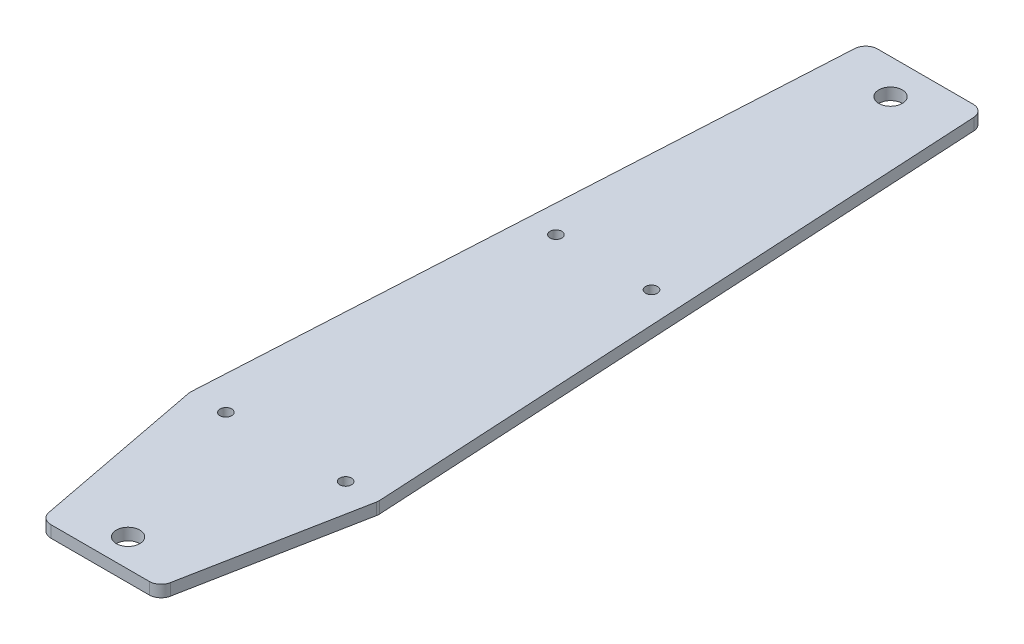
ISO-10303-21;
HEADER;
FILE_DESCRIPTION(('STEP AP214'),'2;1');
FILE_NAME('part.step','',(''),(''),'','','');
FILE_SCHEMA(('AUTOMOTIVE_DESIGN { 1 0 10303 214 1 1 1 1 }'));
ENDSEC;
DATA;
#1=APPLICATION_CONTEXT('core data for automotive mechanical design processes');
#2=APPLICATION_PROTOCOL_DEFINITION('international standard','automotive_design',2000,#1);
#3=PRODUCT_CONTEXT('',#1,'mechanical');
#4=PRODUCT('Part','Part','',(#3));
#5=PRODUCT_RELATED_PRODUCT_CATEGORY('part','',(#4));
#6=PRODUCT_DEFINITION_FORMATION('','',#4);
#7=PRODUCT_DEFINITION_CONTEXT('part definition',#1,'design');
#8=PRODUCT_DEFINITION('design','',#6,#7);
#9=PRODUCT_DEFINITION_SHAPE('','',#8);
#10=(LENGTH_UNIT() NAMED_UNIT(*) SI_UNIT(.MILLI.,.METRE.));
#11=(NAMED_UNIT(*) PLANE_ANGLE_UNIT() SI_UNIT($,.RADIAN.));
#12=(NAMED_UNIT(*) SI_UNIT($,.STERADIAN.) SOLID_ANGLE_UNIT());
#13=UNCERTAINTY_MEASURE_WITH_UNIT(LENGTH_MEASURE(1.E-05),#10,'distance_accuracy_value','');
#14=(GEOMETRIC_REPRESENTATION_CONTEXT(3) GLOBAL_UNCERTAINTY_ASSIGNED_CONTEXT((#13)) GLOBAL_UNIT_ASSIGNED_CONTEXT((#10,
#11,#12)) REPRESENTATION_CONTEXT('',''));
#15=CARTESIAN_POINT('',(0.,0.,0.));
#16=DIRECTION('',(0.,0.,1.));
#17=DIRECTION('',(1.,0.,0.));
#18=AXIS2_PLACEMENT_3D('',#15,#16,#17);
#19=CARTESIAN_POINT('',(0.,5.,0.));
#20=DIRECTION('',(0.,0.,-1.));
#21=DIRECTION('',(-1.,0.,0.));
#22=AXIS2_PLACEMENT_3D('',#19,#20,#21);
#23=PLANE('',#22);
#24=DIRECTION('',(1.,0.,0.));
#25=VECTOR('',#24,1.);
#26=CARTESIAN_POINT('',(0.,0.,0.));
#27=LINE('',#26,#25);
#28=CARTESIAN_POINT('',(4.13012721746611,0.,0.));
#29=VERTEX_POINT('',#28);
#30=CARTESIAN_POINT('',(45.8698727825338,0.,0.));
#31=VERTEX_POINT('',#30);
#32=EDGE_CURVE('E193',#29,#31,#27,.T.);
#33=ORIENTED_EDGE('',*,*,#32,.T.);
#34=DIRECTION('',(0.,-1.,0.));
#35=VECTOR('',#34,1.);
#36=CARTESIAN_POINT('',(45.8698727825338,5.,0.));
#37=LINE('',#36,#35);
#38=CARTESIAN_POINT('',(45.8698727825338,5.,0.));
#39=VERTEX_POINT('',#38);
#40=EDGE_CURVE('E11',#39,#31,#37,.T.);
#41=ORIENTED_EDGE('',*,*,#40,.F.);
#42=DIRECTION('',(1.,0.,0.));
#43=VECTOR('',#42,1.);
#44=CARTESIAN_POINT('',(0.,5.,0.));
#45=LINE('',#44,#43);
#46=CARTESIAN_POINT('',(4.13012721746611,5.,0.));
#47=VERTEX_POINT('',#46);
#48=EDGE_CURVE('E510',#47,#39,#45,.T.);
#49=ORIENTED_EDGE('',*,*,#48,.F.);
#50=DIRECTION('',(0.,-1.,0.));
#51=VECTOR('',#50,1.);
#52=CARTESIAN_POINT('',(4.13012721746611,5.,0.));
#53=LINE('',#52,#51);
#54=EDGE_CURVE('E59',#47,#29,#53,.T.);
#55=ORIENTED_EDGE('',*,*,#54,.T.);
#56=EDGE_LOOP('',(#33,#41,#49,#55));
#57=FACE_BOUND('',#56,.T.);
#58=ADVANCED_FACE('F41',(#57),#23,.F.);
#59=CARTESIAN_POINT('',(45.8698727825339,5.,-5.));
#60=DIRECTION('',(0.,-1.,0.));
#61=DIRECTION('',(0.,0.,-1.));
#62=AXIS2_PLACEMENT_3D('',#59,#60,#61);
#63=CYLINDRICAL_SURFACE('',#62,4.99999999999992);
#64=CARTESIAN_POINT('',(45.8698727825339,0.,-5.));
#65=DIRECTION('',(0.,1.,0.));
#66=DIRECTION('',(0.,0.,1.));
#67=AXIS2_PLACEMENT_3D('',#64,#65,#66);
#68=CIRCLE('',#67,4.99999999999992);
#69=CARTESIAN_POINT('',(50.7799161105115,0.,-4.05582071756382));
#70=VERTEX_POINT('',#69);
#71=EDGE_CURVE('E196',#31,#70,#68,.T.);
#72=ORIENTED_EDGE('',*,*,#71,.T.);
#73=DIRECTION('',(0.,-1.,0.));
#74=VECTOR('',#73,1.);
#75=CARTESIAN_POINT('',(50.7799161105115,5.,-4.05582071756382));
#76=LINE('',#75,#74);
#77=CARTESIAN_POINT('',(50.7799161105115,5.,-4.05582071756382));
#78=VERTEX_POINT('',#77);
#79=EDGE_CURVE('E51',#78,#70,#76,.T.);
#80=ORIENTED_EDGE('',*,*,#79,.F.);
#81=CARTESIAN_POINT('',(45.8698727825339,5.,-5.));
#82=DIRECTION('',(0.,1.,0.));
#83=DIRECTION('',(0.,0.,1.));
#84=AXIS2_PLACEMENT_3D('',#81,#82,#83);
#85=CIRCLE('',#84,4.99999999999992);
#86=EDGE_CURVE('E109',#39,#78,#85,.T.);
#87=ORIENTED_EDGE('',*,*,#86,.F.);
#88=ORIENTED_EDGE('',*,*,#40,.T.);
#89=EDGE_LOOP('',(#72,#80,#87,#88));
#90=FACE_BOUND('',#89,.T.);
#91=ADVANCED_FACE('F320',(#90),#63,.T.);
#92=CARTESIAN_POINT('',(48.2170509652366,5.,9.27192237228111));
#93=DIRECTION('',(-0.982008665595539,0.,-0.188835856487237));
#94=DIRECTION('',(-0.188835856487237,0.,0.982008665595539));
#95=AXIS2_PLACEMENT_3D('',#92,#93,#94);
#96=PLANE('',#95);
#97=DIRECTION('',(0.188835856487237,0.,-0.982008665595539));
#98=VECTOR('',#97,1.);
#99=CARTESIAN_POINT('',(48.2170509652366,0.,9.27192237228111));
#100=LINE('',#99,#98);
#101=CARTESIAN_POINT('',(64.8837230235631,0.,-77.4002631563285));
#102=VERTEX_POINT('',#101);
#103=EDGE_CURVE('E199',#70,#102,#100,.T.);
#104=ORIENTED_EDGE('',*,*,#103,.T.);
#105=DIRECTION('',(0.,-1.,0.));
#106=VECTOR('',#105,1.);
#107=CARTESIAN_POINT('',(64.8837230235631,5.,-77.4002631563285));
#108=LINE('',#107,#106);
#109=CARTESIAN_POINT('',(64.8837230235631,5.,-77.4002631563285));
#110=VERTEX_POINT('',#109);
#111=EDGE_CURVE('E256',#110,#102,#108,.T.);
#112=ORIENTED_EDGE('',*,*,#111,.F.);
#113=DIRECTION('',(0.188835856487237,0.,-0.982008665595539));
#114=VECTOR('',#113,1.);
#115=CARTESIAN_POINT('',(48.2170509652366,5.,9.27192237228111));
#116=LINE('',#115,#114);
#117=EDGE_CURVE('E266',#78,#110,#116,.T.);
#118=ORIENTED_EDGE('',*,*,#117,.F.);
#119=ORIENTED_EDGE('',*,*,#79,.T.);
#120=EDGE_LOOP('',(#104,#112,#118,#119));
#121=FACE_BOUND('',#120,.T.);
#122=ADVANCED_FACE('F264',(#121),#96,.F.);
#123=CARTESIAN_POINT('',(59.9736796955854,5.,-78.3444424387646));
#124=DIRECTION('',(0.,-1.,0.));
#125=DIRECTION('',(0.,0.,-1.));
#126=AXIS2_PLACEMENT_3D('',#123,#124,#125);
#127=CYLINDRICAL_SURFACE('',#126,5.);
#128=CARTESIAN_POINT('',(59.9736796955854,0.,-78.3444424387646));
#129=DIRECTION('',(0.,1.,0.));
#130=DIRECTION('',(0.,0.,1.));
#131=AXIS2_PLACEMENT_3D('',#128,#129,#130);
#132=CIRCLE('',#131,5.);
#133=CARTESIAN_POINT('',(64.9660937231544,0.,-78.6197643909094));
#134=VERTEX_POINT('',#133);
#135=EDGE_CURVE('E202',#102,#134,#132,.T.);
#136=ORIENTED_EDGE('',*,*,#135,.T.);
#137=DIRECTION('',(0.,-1.,0.));
#138=VECTOR('',#137,1.);
#139=CARTESIAN_POINT('',(64.9660937231544,5.,-78.6197643909094));
#140=LINE('',#139,#138);
#141=CARTESIAN_POINT('',(64.9660937231544,5.,-78.6197643909094));
#142=VERTEX_POINT('',#141);
#143=EDGE_CURVE('E253',#142,#134,#140,.T.);
#144=ORIENTED_EDGE('',*,*,#143,.F.);
#145=CARTESIAN_POINT('',(59.9736796955854,5.,-78.3444424387646));
#146=DIRECTION('',(0.,1.,0.));
#147=DIRECTION('',(0.,0.,1.));
#148=AXIS2_PLACEMENT_3D('',#145,#146,#147);
#149=CIRCLE('',#148,5.);
#150=EDGE_CURVE('E276',#110,#142,#149,.T.);
#151=ORIENTED_EDGE('',*,*,#150,.F.);
#152=ORIENTED_EDGE('',*,*,#111,.T.);
#153=EDGE_LOOP('',(#136,#144,#151,#152));
#154=FACE_BOUND('',#153,.T.);
#155=ADVANCED_FACE('F273',(#154),#127,.T.);
#156=CARTESIAN_POINT('',(69.0916921091236,5.,-3.81027283462876));
#157=DIRECTION('',(0.99848280551379,0.,-0.055064390428943));
#158=DIRECTION('',(-0.055064390428943,0.,-0.99848280551379));
#159=AXIS2_PLACEMENT_3D('',#156,#157,#158);
#160=PLANE('',#159);
#161=DIRECTION('',(0.055064390428943,0.,0.99848280551379));
#162=VECTOR('',#161,1.);
#163=CARTESIAN_POINT('',(69.0916921091236,0.,-3.81027283462876));
#164=LINE('',#163,#162);
#165=CARTESIAN_POINT('',(50.2605568320671,0.,-345.275321952145));
#166=VERTEX_POINT('',#165);
#167=EDGE_CURVE('E206',#166,#134,#164,.T.);
#168=ORIENTED_EDGE('',*,*,#167,.F.);
#169=DIRECTION('',(0.,-1.,0.));
#170=VECTOR('',#169,1.);
#171=CARTESIAN_POINT('',(50.2605568320671,5.,-345.275321952145));
#172=LINE('',#171,#170);
#173=CARTESIAN_POINT('',(50.2605568320671,5.,-345.275321952145));
#174=VERTEX_POINT('',#173);
#175=EDGE_CURVE('E250',#174,#166,#172,.T.);
#176=ORIENTED_EDGE('',*,*,#175,.F.);
#177=DIRECTION('',(0.055064390428943,0.,0.99848280551379));
#178=VECTOR('',#177,1.);
#179=CARTESIAN_POINT('',(69.0916921091236,5.,-3.81027283462876));
#180=LINE('',#179,#178);
#181=EDGE_CURVE('E279',#174,#142,#180,.T.);
#182=ORIENTED_EDGE('',*,*,#181,.T.);
#183=ORIENTED_EDGE('',*,*,#143,.T.);
#184=EDGE_LOOP('',(#168,#176,#182,#183));
#185=FACE_BOUND('',#184,.T.);
#186=ADVANCED_FACE('F470',(#185),#160,.T.);
#187=CARTESIAN_POINT('',(45.2681428044982,5.,-345.));
#188=DIRECTION('',(0.,-1.,0.));
#189=DIRECTION('',(0.,0.,-1.));
#190=AXIS2_PLACEMENT_3D('',#187,#188,#189);
#191=CYLINDRICAL_SURFACE('',#190,5.);
#192=CARTESIAN_POINT('',(45.2681428044982,0.,-345.));
#193=DIRECTION('',(0.,1.,0.));
#194=DIRECTION('',(0.,0.,1.));
#195=AXIS2_PLACEMENT_3D('',#192,#193,#194);
#196=CIRCLE('',#195,5.);
#197=CARTESIAN_POINT('',(45.2681428044981,0.,-350.));
#198=VERTEX_POINT('',#197);
#199=EDGE_CURVE('E210',#198,#166,#196,.F.);
#200=ORIENTED_EDGE('',*,*,#199,.F.);
#201=DIRECTION('',(0.,-1.,0.));
#202=VECTOR('',#201,1.);
#203=CARTESIAN_POINT('',(45.2681428044981,5.,-350.));
#204=LINE('',#203,#202);
#205=CARTESIAN_POINT('',(45.2681428044981,5.,-350.));
#206=VERTEX_POINT('',#205);
#207=EDGE_CURVE('E247',#206,#198,#204,.T.);
#208=ORIENTED_EDGE('',*,*,#207,.F.);
#209=CARTESIAN_POINT('',(45.2681428044982,5.,-345.));
#210=DIRECTION('',(0.,1.,0.));
#211=DIRECTION('',(0.,0.,1.));
#212=AXIS2_PLACEMENT_3D('',#209,#210,#211);
#213=CIRCLE('',#212,5.);
#214=EDGE_CURVE('E283',#206,#174,#213,.F.);
#215=ORIENTED_EDGE('',*,*,#214,.T.);
#216=ORIENTED_EDGE('',*,*,#175,.T.);
#217=EDGE_LOOP('',(#200,#208,#215,#216));
#218=FACE_BOUND('',#217,.T.);
#219=ADVANCED_FACE('F461',(#218),#191,.T.);
#220=CARTESIAN_POINT('',(0.,5.,-350.));
#221=DIRECTION('',(0.,0.,-1.));
#222=DIRECTION('',(-1.,0.,0.));
#223=AXIS2_PLACEMENT_3D('',#220,#221,#222);
#224=PLANE('',#223);
#225=DIRECTION('',(1.,0.,0.));
#226=VECTOR('',#225,1.);
#227=CARTESIAN_POINT('',(0.,0.,-350.));
#228=LINE('',#227,#226);
#229=CARTESIAN_POINT('',(4.73185719550187,0.,-350.));
#230=VERTEX_POINT('',#229);
#231=EDGE_CURVE('E214',#230,#198,#228,.T.);
#232=ORIENTED_EDGE('',*,*,#231,.F.);
#233=DIRECTION('',(0.,-1.,0.));
#234=VECTOR('',#233,1.);
#235=CARTESIAN_POINT('',(4.73185719550187,5.,-350.));
#236=LINE('',#235,#234);
#237=CARTESIAN_POINT('',(4.73185719550187,5.,-350.));
#238=VERTEX_POINT('',#237);
#239=EDGE_CURVE('E244',#238,#230,#236,.T.);
#240=ORIENTED_EDGE('',*,*,#239,.F.);
#241=DIRECTION('',(1.,0.,0.));
#242=VECTOR('',#241,1.);
#243=CARTESIAN_POINT('',(0.,5.,-350.));
#244=LINE('',#243,#242);
#245=EDGE_CURVE('E291',#238,#206,#244,.T.);
#246=ORIENTED_EDGE('',*,*,#245,.T.);
#247=ORIENTED_EDGE('',*,*,#207,.T.);
#248=EDGE_LOOP('',(#232,#240,#246,#247));
#249=FACE_BOUND('',#248,.T.);
#250=ADVANCED_FACE('F306',(#249),#224,.T.);
#251=CARTESIAN_POINT('',(4.73185719550184,5.,-345.));
#252=DIRECTION('',(0.,-1.,0.));
#253=DIRECTION('',(0.,0.,-1.));
#254=AXIS2_PLACEMENT_3D('',#251,#252,#253);
#255=CYLINDRICAL_SURFACE('',#254,5.);
#256=CARTESIAN_POINT('',(4.73185719550184,0.,-345.));
#257=DIRECTION('',(0.,1.,0.));
#258=DIRECTION('',(0.,0.,1.));
#259=AXIS2_PLACEMENT_3D('',#256,#257,#258);
#260=CIRCLE('',#259,5.);
#261=CARTESIAN_POINT('',(-0.260556832067119,0.,-345.275321952145));
#262=VERTEX_POINT('',#261);
#263=EDGE_CURVE('E218',#262,#230,#260,.F.);
#264=ORIENTED_EDGE('',*,*,#263,.F.);
#265=DIRECTION('',(0.,-1.,0.));
#266=VECTOR('',#265,1.);
#267=CARTESIAN_POINT('',(-0.260556832067119,5.,-345.275321952145));
#268=LINE('',#267,#266);
#269=CARTESIAN_POINT('',(-0.260556832067119,5.,-345.275321952145));
#270=VERTEX_POINT('',#269);
#271=EDGE_CURVE('E241',#270,#262,#268,.T.);
#272=ORIENTED_EDGE('',*,*,#271,.F.);
#273=CARTESIAN_POINT('',(4.73185719550184,5.,-345.));
#274=DIRECTION('',(0.,1.,0.));
#275=DIRECTION('',(0.,0.,1.));
#276=AXIS2_PLACEMENT_3D('',#273,#274,#275);
#277=CIRCLE('',#276,5.);
#278=EDGE_CURVE('E295',#270,#238,#277,.F.);
#279=ORIENTED_EDGE('',*,*,#278,.T.);
#280=ORIENTED_EDGE('',*,*,#239,.T.);
#281=EDGE_LOOP('',(#264,#272,#279,#280));
#282=FACE_BOUND('',#281,.T.);
#283=ADVANCED_FACE('F301',(#282),#255,.T.);
#284=CARTESIAN_POINT('',(-19.2432964637887,5.,-1.06123048265882));
#285=DIRECTION('',(0.99848280551379,0.,0.0550643904289417));
#286=DIRECTION('',(0.0550643904289417,0.,-0.99848280551379));
#287=AXIS2_PLACEMENT_3D('',#284,#285,#286);
#288=PLANE('',#287);
#289=DIRECTION('',(-0.0550643904289417,0.,0.99848280551379));
#290=VECTOR('',#289,1.);
#291=CARTESIAN_POINT('',(-19.2432964637887,0.,-1.06123048265882));
#292=LINE('',#291,#290);
#293=CARTESIAN_POINT('',(-14.9660937231547,0.,-78.6197643908975));
#294=VERTEX_POINT('',#293);
#295=EDGE_CURVE('E222',#262,#294,#292,.T.);
#296=ORIENTED_EDGE('',*,*,#295,.T.);
#297=DIRECTION('',(0.,-1.,0.));
#298=VECTOR('',#297,1.);
#299=CARTESIAN_POINT('',(-14.9660937231547,5.,-78.6197643908975));
#300=LINE('',#299,#298);
#301=CARTESIAN_POINT('',(-14.9660937231547,5.,-78.6197643908975));
#302=VERTEX_POINT('',#301);
#303=EDGE_CURVE('E159',#302,#294,#300,.T.);
#304=ORIENTED_EDGE('',*,*,#303,.F.);
#305=DIRECTION('',(-0.0550643904289417,0.,0.99848280551379));
#306=VECTOR('',#305,1.);
#307=CARTESIAN_POINT('',(-19.2432964637887,5.,-1.06123048265882));
#308=LINE('',#307,#306);
#309=EDGE_CURVE('E145',#270,#302,#308,.T.);
#310=ORIENTED_EDGE('',*,*,#309,.F.);
#311=ORIENTED_EDGE('',*,*,#271,.T.);
#312=EDGE_LOOP('',(#296,#304,#310,#311));
#313=FACE_BOUND('',#312,.T.);
#314=ADVANCED_FACE('F310',(#313),#288,.F.);
#315=CARTESIAN_POINT('',(-9.97367969558557,5.,-78.3444424387504));
#316=DIRECTION('',(0.,-1.,0.));
#317=DIRECTION('',(0.,0.,-1.));
#318=AXIS2_PLACEMENT_3D('',#315,#316,#317);
#319=CYLINDRICAL_SURFACE('',#318,5.);
#320=CARTESIAN_POINT('',(-9.97367969558557,0.,-78.3444424387504));
#321=DIRECTION('',(0.,1.,0.));
#322=DIRECTION('',(0.,0.,1.));
#323=AXIS2_PLACEMENT_3D('',#320,#321,#322);
#324=CIRCLE('',#323,5.);
#325=CARTESIAN_POINT('',(-14.8837230235634,0.,-77.4002631563164));
#326=VERTEX_POINT('',#325);
#327=EDGE_CURVE('E155',#294,#326,#324,.T.);
#328=ORIENTED_EDGE('',*,*,#327,.T.);
#329=DIRECTION('',(0.,-1.,0.));
#330=VECTOR('',#329,1.);
#331=CARTESIAN_POINT('',(-14.8837230235634,5.,-77.4002631563164));
#332=LINE('',#331,#330);
#333=CARTESIAN_POINT('',(-14.8837230235634,5.,-77.4002631563164));
#334=VERTEX_POINT('',#333);
#335=EDGE_CURVE('E152',#334,#326,#332,.T.);
#336=ORIENTED_EDGE('',*,*,#335,.F.);
#337=CARTESIAN_POINT('',(-9.97367969558557,5.,-78.3444424387504));
#338=DIRECTION('',(0.,1.,0.));
#339=DIRECTION('',(0.,0.,1.));
#340=AXIS2_PLACEMENT_3D('',#337,#338,#339);
#341=CIRCLE('',#340,5.);
#342=EDGE_CURVE('E137',#302,#334,#341,.T.);
#343=ORIENTED_EDGE('',*,*,#342,.F.);
#344=ORIENTED_EDGE('',*,*,#303,.T.);
#345=EDGE_LOOP('',(#328,#336,#343,#344));
#346=FACE_BOUND('',#345,.T.);
#347=ADVANCED_FACE('F153',(#346),#319,.T.);
#348=CARTESIAN_POINT('',(0.,5.,0.));
#349=DIRECTION('',(-0.982008665595533,0.,0.188835856487269));
#350=DIRECTION('',(0.188835856487269,0.,0.982008665595533));
#351=AXIS2_PLACEMENT_3D('',#348,#349,#350);
#352=PLANE('',#351);
#353=DIRECTION('',(-0.188835856487269,0.,-0.982008665595533));
#354=VECTOR('',#353,1.);
#355=CARTESIAN_POINT('',(0.,0.,0.));
#356=LINE('',#355,#354);
#357=CARTESIAN_POINT('',(-0.779916110511593,0.,-4.05582071756369));
#358=VERTEX_POINT('',#357);
#359=EDGE_CURVE('E227',#358,#326,#356,.T.);
#360=ORIENTED_EDGE('',*,*,#359,.F.);
#361=DIRECTION('',(0.,-1.,0.));
#362=VECTOR('',#361,1.);
#363=CARTESIAN_POINT('',(-0.779916110511593,5.,-4.05582071756369));
#364=LINE('',#363,#362);
#365=CARTESIAN_POINT('',(-0.779916110511593,5.,-4.05582071756369));
#366=VERTEX_POINT('',#365);
#367=EDGE_CURVE('E97',#366,#358,#364,.T.);
#368=ORIENTED_EDGE('',*,*,#367,.F.);
#369=DIRECTION('',(-0.188835856487269,0.,-0.982008665595533));
#370=VECTOR('',#369,1.);
#371=CARTESIAN_POINT('',(0.,5.,0.));
#372=LINE('',#371,#370);
#373=EDGE_CURVE('E142',#366,#334,#372,.T.);
#374=ORIENTED_EDGE('',*,*,#373,.T.);
#375=ORIENTED_EDGE('',*,*,#335,.T.);
#376=EDGE_LOOP('',(#360,#368,#374,#375));
#377=FACE_BOUND('',#376,.T.);
#378=ADVANCED_FACE('F161',(#377),#352,.T.);
#379=CARTESIAN_POINT('',(50.7799161105116,5.,-78.3444424387551));
#380=DIRECTION('',(0.,-1.,0.));
#381=DIRECTION('',(0.,0.,-1.));
#382=AXIS2_PLACEMENT_3D('',#379,#380,#381);
#383=CYLINDRICAL_SURFACE('',#382,2.5);
#384=CARTESIAN_POINT('',(50.7799161105116,5.,-78.3444424387551));
#385=DIRECTION('',(0.,1.,0.));
#386=DIRECTION('',(0.,0.,1.));
#387=AXIS2_PLACEMENT_3D('',#384,#385,#386);
#388=CIRCLE('',#387,2.5);
#389=CARTESIAN_POINT('',(50.7799161105116,5.,-75.8444424387551));
#390=VERTEX_POINT('',#389);
#391=EDGE_CURVE('E512',#390,#390,#388,.T.);
#392=ORIENTED_EDGE('',*,*,#391,.T.);
#393=EDGE_LOOP('',(#392));
#394=FACE_BOUND('',#393,.T.);
#395=CARTESIAN_POINT('',(50.7799161105116,0.,-78.3444424387551));
#396=DIRECTION('',(0.,1.,0.));
#397=DIRECTION('',(0.,0.,1.));
#398=AXIS2_PLACEMENT_3D('',#395,#396,#397);
#399=CIRCLE('',#398,2.5);
#400=CARTESIAN_POINT('',(50.7799161105116,0.,-75.8444424387551));
#401=VERTEX_POINT('',#400);
#402=EDGE_CURVE('E189',#401,#401,#399,.T.);
#403=ORIENTED_EDGE('',*,*,#402,.F.);
#404=EDGE_LOOP('',(#403));
#405=FACE_BOUND('',#404,.T.);
#406=ADVANCED_FACE('F328',(#394,#405),#383,.F.);
#407=CARTESIAN_POINT('',(0.,5.,-78.3444424387504));
#408=DIRECTION('',(0.,-1.,0.));
#409=DIRECTION('',(0.,0.,-1.));
#410=AXIS2_PLACEMENT_3D('',#407,#408,#409);
#411=CYLINDRICAL_SURFACE('',#410,2.5);
#412=CARTESIAN_POINT('',(0.,5.,-78.3444424387504));
#413=DIRECTION('',(0.,1.,0.));
#414=DIRECTION('',(0.,0.,1.));
#415=AXIS2_PLACEMENT_3D('',#412,#413,#414);
#416=CIRCLE('',#415,2.5);
#417=CARTESIAN_POINT('',(0.,5.,-75.8444424387504));
#418=VERTEX_POINT('',#417);
#419=EDGE_CURVE('E517',#418,#418,#416,.T.);
#420=ORIENTED_EDGE('',*,*,#419,.T.);
#421=EDGE_LOOP('',(#420));
#422=FACE_BOUND('',#421,.T.);
#423=CARTESIAN_POINT('',(0.,0.,-78.3444424387504));
#424=DIRECTION('',(0.,1.,0.));
#425=DIRECTION('',(0.,0.,1.));
#426=AXIS2_PLACEMENT_3D('',#423,#424,#425);
#427=CIRCLE('',#426,2.5);
#428=CARTESIAN_POINT('',(0.,0.,-75.8444424387504));
#429=VERTEX_POINT('',#428);
#430=EDGE_CURVE('E185',#429,#429,#427,.T.);
#431=ORIENTED_EDGE('',*,*,#430,.F.);
#432=EDGE_LOOP('',(#431));
#433=FACE_BOUND('',#432,.T.);
#434=ADVANCED_FACE('F331',(#422,#433),#411,.F.);
#435=CARTESIAN_POINT('',(25.,5.,-11.8767813343963));
#436=DIRECTION('',(0.,-1.,0.));
#437=DIRECTION('',(0.,0.,-1.));
#438=AXIS2_PLACEMENT_3D('',#435,#436,#437);
#439=CYLINDRICAL_SURFACE('',#438,5.);
#440=CARTESIAN_POINT('',(25.,5.,-11.8767813343963));
#441=DIRECTION('',(0.,1.,0.));
#442=DIRECTION('',(0.,0.,1.));
#443=AXIS2_PLACEMENT_3D('',#440,#441,#442);
#444=CIRCLE('',#443,5.);
#445=CARTESIAN_POINT('',(25.,5.,-6.87678133439629));
#446=VERTEX_POINT('',#445);
#447=EDGE_CURVE('E523',#446,#446,#444,.T.);
#448=ORIENTED_EDGE('',*,*,#447,.T.);
#449=EDGE_LOOP('',(#448));
#450=FACE_BOUND('',#449,.T.);
#451=CARTESIAN_POINT('',(25.,0.,-11.8767813343963));
#452=DIRECTION('',(0.,1.,0.));
#453=DIRECTION('',(0.,0.,1.));
#454=AXIS2_PLACEMENT_3D('',#451,#452,#453);
#455=CIRCLE('',#454,5.);
#456=CARTESIAN_POINT('',(25.,0.,-6.87678133439629));
#457=VERTEX_POINT('',#456);
#458=EDGE_CURVE('E181',#457,#457,#455,.T.);
#459=ORIENTED_EDGE('',*,*,#458,.F.);
#460=EDGE_LOOP('',(#459));
#461=FACE_BOUND('',#460,.T.);
#462=ADVANCED_FACE('F335',(#450,#461),#439,.F.);
#463=CARTESIAN_POINT('',(45.2681428044982,5.,-213.589521960383));
#464=DIRECTION('',(0.,-1.,0.));
#465=DIRECTION('',(0.,0.,-1.));
#466=AXIS2_PLACEMENT_3D('',#463,#464,#465);
#467=CYLINDRICAL_SURFACE('',#466,2.5);
#468=CARTESIAN_POINT('',(45.2681428044982,5.,-213.589521960383));
#469=DIRECTION('',(0.,1.,0.));
#470=DIRECTION('',(0.,0.,1.));
#471=AXIS2_PLACEMENT_3D('',#468,#469,#470);
#472=CIRCLE('',#471,2.5);
#473=CARTESIAN_POINT('',(45.2681428044982,5.,-211.089521960383));
#474=VERTEX_POINT('',#473);
#475=EDGE_CURVE('E527',#474,#474,#472,.T.);
#476=ORIENTED_EDGE('',*,*,#475,.T.);
#477=EDGE_LOOP('',(#476));
#478=FACE_BOUND('',#477,.T.);
#479=CARTESIAN_POINT('',(45.2681428044982,0.,-213.589521960383));
#480=DIRECTION('',(0.,1.,0.));
#481=DIRECTION('',(0.,0.,1.));
#482=AXIS2_PLACEMENT_3D('',#479,#480,#481);
#483=CIRCLE('',#482,2.5);
#484=CARTESIAN_POINT('',(45.2681428044982,0.,-211.089521960383));
#485=VERTEX_POINT('',#484);
#486=EDGE_CURVE('E177',#485,#485,#483,.T.);
#487=ORIENTED_EDGE('',*,*,#486,.F.);
#488=EDGE_LOOP('',(#487));
#489=FACE_BOUND('',#488,.T.);
#490=ADVANCED_FACE('F339',(#478,#489),#467,.F.);
#491=CARTESIAN_POINT('',(4.73185719550184,5.,-213.589521960383));
#492=DIRECTION('',(0.,-1.,0.));
#493=DIRECTION('',(0.,0.,-1.));
#494=AXIS2_PLACEMENT_3D('',#491,#492,#493);
#495=CYLINDRICAL_SURFACE('',#494,2.5);
#496=CARTESIAN_POINT('',(4.73185719550184,5.,-213.589521960383));
#497=DIRECTION('',(0.,1.,0.));
#498=DIRECTION('',(0.,0.,1.));
#499=AXIS2_PLACEMENT_3D('',#496,#497,#498);
#500=CIRCLE('',#499,2.5);
#501=CARTESIAN_POINT('',(4.73185719550184,5.,-211.089521960383));
#502=VERTEX_POINT('',#501);
#503=EDGE_CURVE('E354',#502,#502,#500,.T.);
#504=ORIENTED_EDGE('',*,*,#503,.T.);
#505=EDGE_LOOP('',(#504));
#506=FACE_BOUND('',#505,.T.);
#507=CARTESIAN_POINT('',(4.73185719550184,0.,-213.589521960383));
#508=DIRECTION('',(0.,1.,0.));
#509=DIRECTION('',(0.,0.,1.));
#510=AXIS2_PLACEMENT_3D('',#507,#508,#509);
#511=CIRCLE('',#510,2.5);
#512=CARTESIAN_POINT('',(4.73185719550184,0.,-211.089521960383));
#513=VERTEX_POINT('',#512);
#514=EDGE_CURVE('E173',#513,#513,#511,.T.);
#515=ORIENTED_EDGE('',*,*,#514,.F.);
#516=EDGE_LOOP('',(#515));
#517=FACE_BOUND('',#516,.T.);
#518=ADVANCED_FACE('F342',(#506,#517),#495,.F.);
#519=CARTESIAN_POINT('',(25.,5.,-335.239262598447));
#520=DIRECTION('',(0.,-1.,0.));
#521=DIRECTION('',(0.,0.,-1.));
#522=AXIS2_PLACEMENT_3D('',#519,#520,#521);
#523=CYLINDRICAL_SURFACE('',#522,5.);
#524=CARTESIAN_POINT('',(25.,5.,-335.239262598447));
#525=DIRECTION('',(0.,1.,0.));
#526=DIRECTION('',(0.,0.,1.));
#527=AXIS2_PLACEMENT_3D('',#524,#525,#526);
#528=CIRCLE('',#527,5.);
#529=CARTESIAN_POINT('',(25.,5.,-330.239262598447));
#530=VERTEX_POINT('',#529);
#531=EDGE_CURVE('E234',#530,#530,#528,.T.);
#532=ORIENTED_EDGE('',*,*,#531,.T.);
#533=EDGE_LOOP('',(#532));
#534=FACE_BOUND('',#533,.T.);
#535=CARTESIAN_POINT('',(25.,0.,-335.239262598447));
#536=DIRECTION('',(0.,1.,0.));
#537=DIRECTION('',(0.,0.,1.));
#538=AXIS2_PLACEMENT_3D('',#535,#536,#537);
#539=CIRCLE('',#538,5.);
#540=CARTESIAN_POINT('',(25.,0.,-330.239262598447));
#541=VERTEX_POINT('',#540);
#542=EDGE_CURVE('E169',#541,#541,#539,.T.);
#543=ORIENTED_EDGE('',*,*,#542,.F.);
#544=EDGE_LOOP('',(#543));
#545=FACE_BOUND('',#544,.T.);
#546=ADVANCED_FACE('F43',(#534,#545),#523,.F.);
#547=CARTESIAN_POINT('',(4.13012721746608,5.,-5.));
#548=DIRECTION('',(0.,-1.,0.));
#549=DIRECTION('',(0.,0.,-1.));
#550=AXIS2_PLACEMENT_3D('',#547,#548,#549);
#551=CYLINDRICAL_SURFACE('',#550,5.);
#552=CARTESIAN_POINT('',(4.13012721746608,0.,-5.));
#553=DIRECTION('',(0.,1.,0.));
#554=DIRECTION('',(0.,0.,1.));
#555=AXIS2_PLACEMENT_3D('',#552,#553,#554);
#556=CIRCLE('',#555,5.);
#557=EDGE_CURVE('E230',#29,#358,#556,.F.);
#558=ORIENTED_EDGE('',*,*,#557,.F.);
#559=ORIENTED_EDGE('',*,*,#54,.F.);
#560=CARTESIAN_POINT('',(4.13012721746608,5.,-5.));
#561=DIRECTION('',(0.,1.,0.));
#562=DIRECTION('',(0.,0.,1.));
#563=AXIS2_PLACEMENT_3D('',#560,#561,#562);
#564=CIRCLE('',#563,5.);
#565=EDGE_CURVE('E163',#47,#366,#564,.F.);
#566=ORIENTED_EDGE('',*,*,#565,.T.);
#567=ORIENTED_EDGE('',*,*,#367,.T.);
#568=EDGE_LOOP('',(#558,#559,#566,#567));
#569=FACE_BOUND('',#568,.T.);
#570=ADVANCED_FACE('F349',(#569),#551,.T.);
#571=CARTESIAN_POINT('',(0.,5.,0.));
#572=DIRECTION('',(0.,1.,0.));
#573=DIRECTION('',(0.,0.,1.));
#574=AXIS2_PLACEMENT_3D('',#571,#572,#573);
#575=PLANE('',#574);
#576=ORIENTED_EDGE('',*,*,#531,.F.);
#577=EDGE_LOOP('',(#576));
#578=FACE_BOUND('',#577,.T.);
#579=ORIENTED_EDGE('',*,*,#503,.F.);
#580=EDGE_LOOP('',(#579));
#581=FACE_BOUND('',#580,.T.);
#582=ORIENTED_EDGE('',*,*,#475,.F.);
#583=EDGE_LOOP('',(#582));
#584=FACE_BOUND('',#583,.T.);
#585=ORIENTED_EDGE('',*,*,#447,.F.);
#586=EDGE_LOOP('',(#585));
#587=FACE_BOUND('',#586,.T.);
#588=ORIENTED_EDGE('',*,*,#419,.F.);
#589=EDGE_LOOP('',(#588));
#590=FACE_BOUND('',#589,.T.);
#591=ORIENTED_EDGE('',*,*,#391,.F.);
#592=EDGE_LOOP('',(#591));
#593=FACE_BOUND('',#592,.T.);
#594=ORIENTED_EDGE('',*,*,#48,.T.);
#595=ORIENTED_EDGE('',*,*,#86,.T.);
#596=ORIENTED_EDGE('',*,*,#117,.T.);
#597=ORIENTED_EDGE('',*,*,#150,.T.);
#598=ORIENTED_EDGE('',*,*,#181,.F.);
#599=ORIENTED_EDGE('',*,*,#214,.F.);
#600=ORIENTED_EDGE('',*,*,#245,.F.);
#601=ORIENTED_EDGE('',*,*,#278,.F.);
#602=ORIENTED_EDGE('',*,*,#309,.T.);
#603=ORIENTED_EDGE('',*,*,#342,.T.);
#604=ORIENTED_EDGE('',*,*,#373,.F.);
#605=ORIENTED_EDGE('',*,*,#565,.F.);
#606=EDGE_LOOP('',(#594,#595,#596,#597,#598,#599,#600,#601,#602,#603,#604,#605));
#607=FACE_BOUND('',#606,.T.);
#608=ADVANCED_FACE('F139',(#578,#581,#584,#587,#590,#593,#607),#575,.T.);
#609=CARTESIAN_POINT('',(0.,0.,0.));
#610=DIRECTION('',(0.,1.,0.));
#611=DIRECTION('',(0.,0.,1.));
#612=AXIS2_PLACEMENT_3D('',#609,#610,#611);
#613=PLANE('',#612);
#614=ORIENTED_EDGE('',*,*,#542,.T.);
#615=EDGE_LOOP('',(#614));
#616=FACE_BOUND('',#615,.T.);
#617=ORIENTED_EDGE('',*,*,#514,.T.);
#618=EDGE_LOOP('',(#617));
#619=FACE_BOUND('',#618,.T.);
#620=ORIENTED_EDGE('',*,*,#486,.T.);
#621=EDGE_LOOP('',(#620));
#622=FACE_BOUND('',#621,.T.);
#623=ORIENTED_EDGE('',*,*,#458,.T.);
#624=EDGE_LOOP('',(#623));
#625=FACE_BOUND('',#624,.T.);
#626=ORIENTED_EDGE('',*,*,#430,.T.);
#627=EDGE_LOOP('',(#626));
#628=FACE_BOUND('',#627,.T.);
#629=ORIENTED_EDGE('',*,*,#402,.T.);
#630=EDGE_LOOP('',(#629));
#631=FACE_BOUND('',#630,.T.);
#632=ORIENTED_EDGE('',*,*,#32,.F.);
#633=ORIENTED_EDGE('',*,*,#557,.T.);
#634=ORIENTED_EDGE('',*,*,#359,.T.);
#635=ORIENTED_EDGE('',*,*,#327,.F.);
#636=ORIENTED_EDGE('',*,*,#295,.F.);
#637=ORIENTED_EDGE('',*,*,#263,.T.);
#638=ORIENTED_EDGE('',*,*,#231,.T.);
#639=ORIENTED_EDGE('',*,*,#199,.T.);
#640=ORIENTED_EDGE('',*,*,#167,.T.);
#641=ORIENTED_EDGE('',*,*,#135,.F.);
#642=ORIENTED_EDGE('',*,*,#103,.F.);
#643=ORIENTED_EDGE('',*,*,#71,.F.);
#644=EDGE_LOOP('',(#632,#633,#634,#635,#636,#637,#638,#639,#640,#641,#642,#643));
#645=FACE_BOUND('',#644,.T.);
#646=ADVANCED_FACE('F269',(#616,#619,#622,#625,#628,#631,#645),#613,.F.);
#647=CLOSED_SHELL('',(#58,#91,#122,#155,#186,#219,#250,#283,#314,#347,#378,#406,#434,#462,#490,
#518,#546,#570,#608,#646));
#648=MANIFOLD_SOLID_BREP('B2',#647);
#649=ADVANCED_BREP_SHAPE_REPRESENTATION('',(#18,#648),#14);
#650=SHAPE_DEFINITION_REPRESENTATION(#9,#649);
ENDSEC;
END-ISO-10303-21;
